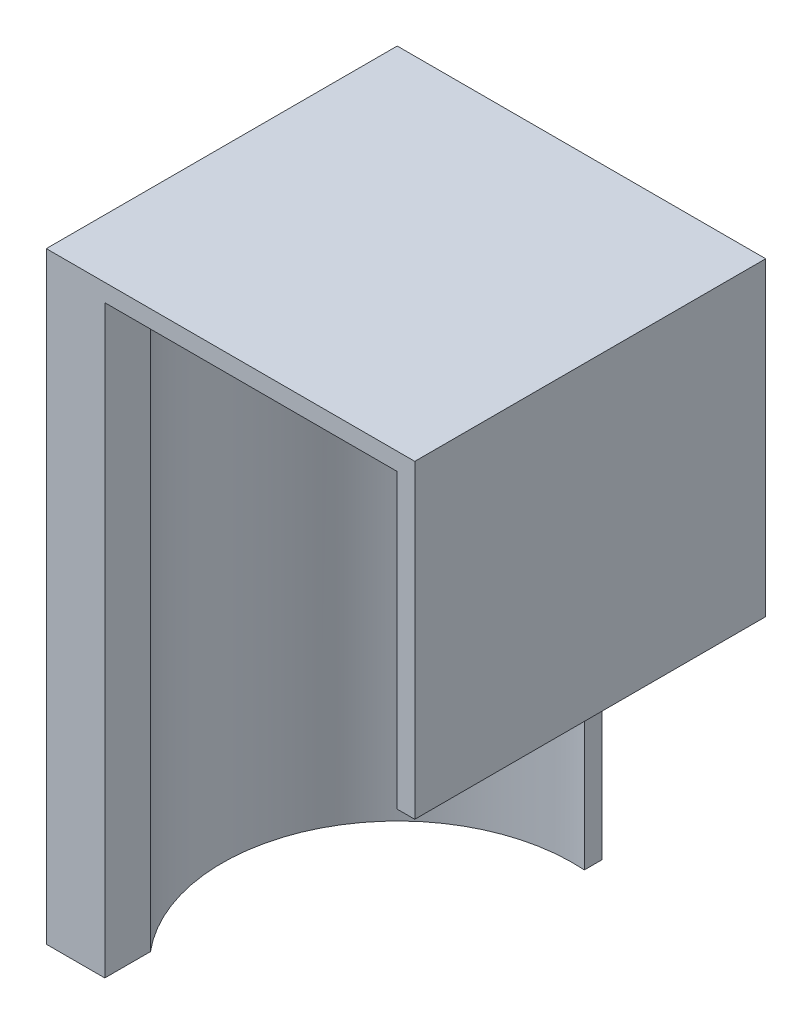
ISO-10303-21;
HEADER;
FILE_DESCRIPTION(('STEP AP214'),'2;1');
FILE_NAME('part.step','',(''),(''),'','','');
FILE_SCHEMA(('AUTOMOTIVE_DESIGN { 1 0 10303 214 1 1 1 1 }'));
ENDSEC;
DATA;
#1=APPLICATION_CONTEXT('core data for automotive mechanical design processes');
#2=APPLICATION_PROTOCOL_DEFINITION('international standard','automotive_design',2000,#1);
#3=PRODUCT_CONTEXT('',#1,'mechanical');
#4=PRODUCT('Part','Part','',(#3));
#5=PRODUCT_RELATED_PRODUCT_CATEGORY('part','',(#4));
#6=PRODUCT_DEFINITION_FORMATION('','',#4);
#7=PRODUCT_DEFINITION_CONTEXT('part definition',#1,'design');
#8=PRODUCT_DEFINITION('design','',#6,#7);
#9=PRODUCT_DEFINITION_SHAPE('','',#8);
#10=(LENGTH_UNIT() NAMED_UNIT(*) SI_UNIT(.MILLI.,.METRE.));
#11=(NAMED_UNIT(*) PLANE_ANGLE_UNIT() SI_UNIT($,.RADIAN.));
#12=(NAMED_UNIT(*) SI_UNIT($,.STERADIAN.) SOLID_ANGLE_UNIT());
#13=UNCERTAINTY_MEASURE_WITH_UNIT(LENGTH_MEASURE(1.E-05),#10,'distance_accuracy_value','');
#14=(GEOMETRIC_REPRESENTATION_CONTEXT(3) GLOBAL_UNCERTAINTY_ASSIGNED_CONTEXT((#13)) GLOBAL_UNIT_ASSIGNED_CONTEXT((#10,
#11,#12)) REPRESENTATION_CONTEXT('',''));
#15=CARTESIAN_POINT('',(0.,0.,0.));
#16=DIRECTION('',(0.,0.,1.));
#17=DIRECTION('',(1.,0.,0.));
#18=AXIS2_PLACEMENT_3D('',#15,#16,#17);
#19=CARTESIAN_POINT('',(63.,50.,-27.));
#20=DIRECTION('',(0.,0.,-1.));
#21=DIRECTION('',(0.,1.,0.));
#22=AXIS2_PLACEMENT_3D('',#19,#20,#21);
#23=PLANE('',#22);
#24=DIRECTION('',(-1.,0.,0.));
#25=VECTOR('',#24,1.);
#26=CARTESIAN_POINT('',(63.,50.,-27.));
#27=LINE('',#26,#25);
#28=CARTESIAN_POINT('',(60.,50.,-27.));
#29=VERTEX_POINT('',#28);
#30=CARTESIAN_POINT('',(30.9999999999999,50.,-27.));
#31=VERTEX_POINT('',#30);
#32=EDGE_CURVE('E54',#29,#31,#27,.T.);
#33=ORIENTED_EDGE('',*,*,#32,.T.);
#34=DIRECTION('',(0.,1.,0.));
#35=VECTOR('',#34,1.);
#36=CARTESIAN_POINT('',(31.0000000000002,-119.462219947249,-27.));
#37=LINE('',#36,#35);
#38=CARTESIAN_POINT('',(31.,0.,-27.));
#39=VERTEX_POINT('',#38);
#40=EDGE_CURVE('E127',#39,#31,#37,.T.);
#41=ORIENTED_EDGE('',*,*,#40,.F.);
#42=DIRECTION('',(-1.,0.,0.));
#43=VECTOR('',#42,1.);
#44=CARTESIAN_POINT('',(63.,0.,-27.));
#45=LINE('',#44,#43);
#46=CARTESIAN_POINT('',(35.,0.,-27.));
#47=VERTEX_POINT('',#46);
#48=EDGE_CURVE('E195',#47,#39,#45,.T.);
#49=ORIENTED_EDGE('',*,*,#48,.F.);
#50=CARTESIAN_POINT('',(60.,0.,-27.));
#51=VERTEX_POINT('',#50);
#52=EDGE_CURVE('E196',#51,#47,#45,.T.);
#53=ORIENTED_EDGE('',*,*,#52,.F.);
#54=DIRECTION('',(0.,-1.,0.));
#55=VECTOR('',#54,1.);
#56=CARTESIAN_POINT('',(60.,50.,-27.));
#57=LINE('',#56,#55);
#58=EDGE_CURVE('E170',#29,#51,#57,.T.);
#59=ORIENTED_EDGE('',*,*,#58,.F.);
#60=EDGE_LOOP('',(#33,#41,#49,#53,#59));
#61=FACE_BOUND('',#60,.T.);
#62=ADVANCED_FACE('F39',(#61),#23,.F.);
#63=CARTESIAN_POINT('',(63.,0.,-30.));
#64=DIRECTION('',(0.,1.,0.));
#65=DIRECTION('',(0.,0.,1.));
#66=AXIS2_PLACEMENT_3D('',#63,#64,#65);
#67=PLANE('',#66);
#68=CARTESIAN_POINT('',(33.,0.,2.93325909419152));
#69=DIRECTION('',(0.,1.,0.));
#70=DIRECTION('',(0.,0.,1.));
#71=AXIS2_PLACEMENT_3D('',#68,#69,#70);
#72=CIRCLE('',#71,30.);
#73=EDGE_CURVE('E155',#47,#39,#72,.T.);
#74=ORIENTED_EDGE('',*,*,#73,.F.);
#75=ORIENTED_EDGE('',*,*,#48,.T.);
#76=EDGE_LOOP('',(#74,#75));
#77=FACE_BOUND('',#76,.T.);
#78=ADVANCED_FACE('F240',(#77),#67,.F.);
#79=DIRECTION('',(0.,0.,1.));
#80=VECTOR('',#79,1.);
#81=CARTESIAN_POINT('',(35.,0.,-30.));
#82=LINE('',#81,#80);
#83=CARTESIAN_POINT('',(35.,0.,-30.));
#84=VERTEX_POINT('',#83);
#85=EDGE_CURVE('E11',#84,#47,#82,.T.);
#86=ORIENTED_EDGE('',*,*,#85,.F.);
#87=DIRECTION('',(-1.,0.,0.));
#88=VECTOR('',#87,1.);
#89=CARTESIAN_POINT('',(63.,0.,-30.));
#90=LINE('',#89,#88);
#91=CARTESIAN_POINT('',(63.,0.,-30.));
#92=VERTEX_POINT('',#91);
#93=EDGE_CURVE('E192',#92,#84,#90,.T.);
#94=ORIENTED_EDGE('',*,*,#93,.F.);
#95=DIRECTION('',(0.,0.,-1.));
#96=VECTOR('',#95,1.);
#97=CARTESIAN_POINT('',(63.,0.,-30.));
#98=LINE('',#97,#96);
#99=CARTESIAN_POINT('',(63.,0.,30.));
#100=VERTEX_POINT('',#99);
#101=EDGE_CURVE('E190',#100,#92,#98,.T.);
#102=ORIENTED_EDGE('',*,*,#101,.F.);
#103=DIRECTION('',(-1.,0.,0.));
#104=VECTOR('',#103,1.);
#105=CARTESIAN_POINT('',(63.,0.,30.));
#106=LINE('',#105,#104);
#107=CARTESIAN_POINT('',(60.,0.,30.));
#108=VERTEX_POINT('',#107);
#109=EDGE_CURVE('E176',#100,#108,#106,.T.);
#110=ORIENTED_EDGE('',*,*,#109,.T.);
#111=DIRECTION('',(0.,0.,-1.));
#112=VECTOR('',#111,1.);
#113=CARTESIAN_POINT('',(60.,0.,80.0899191454728));
#114=LINE('',#113,#112);
#115=EDGE_CURVE('E182',#108,#51,#114,.T.);
#116=ORIENTED_EDGE('',*,*,#115,.T.);
#117=ORIENTED_EDGE('',*,*,#52,.T.);
#118=EDGE_LOOP('',(#86,#94,#102,#110,#116,#117));
#119=FACE_BOUND('',#118,.T.);
#120=ADVANCED_FACE('F227',(#119),#67,.F.);
#121=CARTESIAN_POINT('',(0.,50.,0.));
#122=DIRECTION('',(0.,-1.,0.));
#123=DIRECTION('',(0.,0.,-1.));
#124=AXIS2_PLACEMENT_3D('',#121,#122,#123);
#125=PLANE('',#124);
#126=DIRECTION('',(1.,0.,0.));
#127=VECTOR('',#126,1.);
#128=CARTESIAN_POINT('',(63.,50.,30.));
#129=LINE('',#128,#127);
#130=CARTESIAN_POINT('',(10.,50.,30.));
#131=VERTEX_POINT('',#130);
#132=CARTESIAN_POINT('',(60.,50.,30.));
#133=VERTEX_POINT('',#132);
#134=EDGE_CURVE('E144',#131,#133,#129,.T.);
#135=ORIENTED_EDGE('',*,*,#134,.F.);
#136=DIRECTION('',(0.,0.,1.));
#137=VECTOR('',#136,1.);
#138=CARTESIAN_POINT('',(10.,50.,30.));
#139=LINE('',#138,#137);
#140=CARTESIAN_POINT('',(10.,50.,22.1946193784498));
#141=VERTEX_POINT('',#140);
#142=EDGE_CURVE('E135',#141,#131,#139,.T.);
#143=ORIENTED_EDGE('',*,*,#142,.F.);
#144=CARTESIAN_POINT('',(33.,50.,2.93325909419152));
#145=DIRECTION('',(0.,-1.,0.));
#146=DIRECTION('',(0.,0.,-1.));
#147=AXIS2_PLACEMENT_3D('',#144,#145,#146);
#148=CIRCLE('',#147,30.);
#149=EDGE_CURVE('E47',#141,#31,#148,.T.);
#150=ORIENTED_EDGE('',*,*,#149,.T.);
#151=ORIENTED_EDGE('',*,*,#32,.F.);
#152=DIRECTION('',(0.,0.,-1.));
#153=VECTOR('',#152,1.);
#154=CARTESIAN_POINT('',(60.,50.,80.0899191454728));
#155=LINE('',#154,#153);
#156=EDGE_CURVE('E184',#133,#29,#155,.T.);
#157=ORIENTED_EDGE('',*,*,#156,.F.);
#158=EDGE_LOOP('',(#135,#143,#150,#151,#157));
#159=FACE_BOUND('',#158,.T.);
#160=ADVANCED_FACE('F142',(#159),#125,.T.);
#161=CARTESIAN_POINT('',(3.,50.,30.));
#162=DIRECTION('',(0.,0.,-1.));
#163=DIRECTION('',(0.,1.,0.));
#164=AXIS2_PLACEMENT_3D('',#161,#162,#163);
#165=PLANE('',#164);
#166=DIRECTION('',(-1.,0.,0.));
#167=VECTOR('',#166,1.);
#168=CARTESIAN_POINT('',(3.,-50.,30.));
#169=LINE('',#168,#167);
#170=CARTESIAN_POINT('',(10.,-50.,30.));
#171=VERTEX_POINT('',#170);
#172=CARTESIAN_POINT('',(0.,-50.,30.));
#173=VERTEX_POINT('',#172);
#174=EDGE_CURVE('E130',#171,#173,#169,.T.);
#175=ORIENTED_EDGE('',*,*,#174,.F.);
#176=DIRECTION('',(0.,1.,0.));
#177=VECTOR('',#176,1.);
#178=CARTESIAN_POINT('',(10.,-119.462219947249,30.));
#179=LINE('',#178,#177);
#180=EDGE_CURVE('E140',#171,#131,#179,.T.);
#181=ORIENTED_EDGE('',*,*,#180,.T.);
#182=ORIENTED_EDGE('',*,*,#134,.T.);
#183=DIRECTION('',(0.,1.,0.));
#184=VECTOR('',#183,1.);
#185=CARTESIAN_POINT('',(60.,50.,30.));
#186=LINE('',#185,#184);
#187=EDGE_CURVE('E172',#108,#133,#186,.T.);
#188=ORIENTED_EDGE('',*,*,#187,.F.);
#189=ORIENTED_EDGE('',*,*,#109,.F.);
#190=DIRECTION('',(0.,-1.,0.));
#191=VECTOR('',#190,1.);
#192=CARTESIAN_POINT('',(63.,50.,30.));
#193=LINE('',#192,#191);
#194=CARTESIAN_POINT('',(63.,53.,30.));
#195=VERTEX_POINT('',#194);
#196=EDGE_CURVE('E175',#195,#100,#193,.T.);
#197=ORIENTED_EDGE('',*,*,#196,.F.);
#198=DIRECTION('',(1.,0.,0.));
#199=VECTOR('',#198,1.);
#200=CARTESIAN_POINT('',(63.,53.,30.));
#201=LINE('',#200,#199);
#202=CARTESIAN_POINT('',(0.,53.,30.));
#203=VERTEX_POINT('',#202);
#204=EDGE_CURVE('E167',#203,#195,#201,.T.);
#205=ORIENTED_EDGE('',*,*,#204,.F.);
#206=DIRECTION('',(0.,-1.,0.));
#207=VECTOR('',#206,1.);
#208=CARTESIAN_POINT('',(0.,50.,30.));
#209=LINE('',#208,#207);
#210=EDGE_CURVE('E200',#203,#173,#209,.T.);
#211=ORIENTED_EDGE('',*,*,#210,.T.);
#212=EDGE_LOOP('',(#175,#181,#182,#188,#189,#197,#205,#211));
#213=FACE_BOUND('',#212,.T.);
#214=ADVANCED_FACE('F41',(#213),#165,.F.);
#215=CARTESIAN_POINT('',(3.,-50.,-30.));
#216=DIRECTION('',(0.,1.,0.));
#217=DIRECTION('',(0.,0.,1.));
#218=AXIS2_PLACEMENT_3D('',#215,#216,#217);
#219=PLANE('',#218);
#220=DIRECTION('',(0.,0.,-1.));
#221=VECTOR('',#220,1.);
#222=CARTESIAN_POINT('',(0.,-50.,-30.));
#223=LINE('',#222,#221);
#224=CARTESIAN_POINT('',(0.,-50.,-30.));
#225=VERTEX_POINT('',#224);
#226=EDGE_CURVE('E62',#173,#225,#223,.T.);
#227=ORIENTED_EDGE('',*,*,#226,.T.);
#228=DIRECTION('',(-1.,0.,0.));
#229=VECTOR('',#228,1.);
#230=CARTESIAN_POINT('',(3.,-50.,-30.));
#231=LINE('',#230,#229);
#232=CARTESIAN_POINT('',(35.,-50.,-30.));
#233=VERTEX_POINT('',#232);
#234=EDGE_CURVE('E205',#233,#225,#231,.T.);
#235=ORIENTED_EDGE('',*,*,#234,.F.);
#236=DIRECTION('',(0.,0.,-1.));
#237=VECTOR('',#236,1.);
#238=CARTESIAN_POINT('',(35.,-50.,-30.));
#239=LINE('',#238,#237);
#240=CARTESIAN_POINT('',(35.,-50.,-27.));
#241=VERTEX_POINT('',#240);
#242=EDGE_CURVE('E149',#241,#233,#239,.T.);
#243=ORIENTED_EDGE('',*,*,#242,.F.);
#244=CARTESIAN_POINT('',(33.,-50.,2.93325909419152));
#245=DIRECTION('',(0.,1.,0.));
#246=DIRECTION('',(0.,0.,1.));
#247=AXIS2_PLACEMENT_3D('',#244,#245,#246);
#248=CIRCLE('',#247,30.);
#249=CARTESIAN_POINT('',(10.,-50.,22.1946193784498));
#250=VERTEX_POINT('',#249);
#251=EDGE_CURVE('E235',#250,#241,#248,.F.);
#252=ORIENTED_EDGE('',*,*,#251,.F.);
#253=DIRECTION('',(0.,0.,-1.));
#254=VECTOR('',#253,1.);
#255=CARTESIAN_POINT('',(10.,-50.,30.));
#256=LINE('',#255,#254);
#257=EDGE_CURVE('E138',#171,#250,#256,.T.);
#258=ORIENTED_EDGE('',*,*,#257,.F.);
#259=ORIENTED_EDGE('',*,*,#174,.T.);
#260=EDGE_LOOP('',(#227,#235,#243,#252,#258,#259));
#261=FACE_BOUND('',#260,.T.);
#262=ADVANCED_FACE('F207',(#261),#219,.F.);
#263=CARTESIAN_POINT('',(3.,50.,-30.));
#264=DIRECTION('',(0.,0.,1.));
#265=DIRECTION('',(0.,-1.,0.));
#266=AXIS2_PLACEMENT_3D('',#263,#264,#265);
#267=PLANE('',#266);
#268=DIRECTION('',(0.,1.,0.));
#269=VECTOR('',#268,1.);
#270=CARTESIAN_POINT('',(0.,50.,-30.));
#271=LINE('',#270,#269);
#272=CARTESIAN_POINT('',(0.,53.,-30.));
#273=VERTEX_POINT('',#272);
#274=EDGE_CURVE('E203',#225,#273,#271,.T.);
#275=ORIENTED_EDGE('',*,*,#274,.T.);
#276=DIRECTION('',(-1.,0.,0.));
#277=VECTOR('',#276,1.);
#278=CARTESIAN_POINT('',(63.,53.,-30.));
#279=LINE('',#278,#277);
#280=CARTESIAN_POINT('',(63.,53.,-30.));
#281=VERTEX_POINT('',#280);
#282=EDGE_CURVE('E161',#281,#273,#279,.T.);
#283=ORIENTED_EDGE('',*,*,#282,.F.);
#284=DIRECTION('',(0.,1.,0.));
#285=VECTOR('',#284,1.);
#286=CARTESIAN_POINT('',(63.,50.,-30.));
#287=LINE('',#286,#285);
#288=EDGE_CURVE('E179',#92,#281,#287,.T.);
#289=ORIENTED_EDGE('',*,*,#288,.F.);
#290=ORIENTED_EDGE('',*,*,#93,.T.);
#291=DIRECTION('',(0.,1.,0.));
#292=VECTOR('',#291,1.);
#293=CARTESIAN_POINT('',(35.,-119.462219947249,-30.));
#294=LINE('',#293,#292);
#295=EDGE_CURVE('E145',#233,#84,#294,.T.);
#296=ORIENTED_EDGE('',*,*,#295,.F.);
#297=ORIENTED_EDGE('',*,*,#234,.T.);
#298=EDGE_LOOP('',(#275,#283,#289,#290,#296,#297));
#299=FACE_BOUND('',#298,.T.);
#300=ADVANCED_FACE('F216',(#299),#267,.F.);
#301=CARTESIAN_POINT('',(0.,0.,0.));
#302=DIRECTION('',(-1.,0.,0.));
#303=DIRECTION('',(0.,0.,1.));
#304=AXIS2_PLACEMENT_3D('',#301,#302,#303);
#305=PLANE('',#304);
#306=DIRECTION('',(0.,0.,1.));
#307=VECTOR('',#306,1.);
#308=CARTESIAN_POINT('',(0.,53.,-30.));
#309=LINE('',#308,#307);
#310=EDGE_CURVE('E164',#273,#203,#309,.T.);
#311=ORIENTED_EDGE('',*,*,#310,.F.);
#312=ORIENTED_EDGE('',*,*,#274,.F.);
#313=ORIENTED_EDGE('',*,*,#226,.F.);
#314=ORIENTED_EDGE('',*,*,#210,.F.);
#315=EDGE_LOOP('',(#311,#312,#313,#314));
#316=FACE_BOUND('',#315,.T.);
#317=ADVANCED_FACE('F213',(#316),#305,.T.);
#318=CARTESIAN_POINT('',(63.,0.,0.));
#319=DIRECTION('',(-1.,0.,0.));
#320=DIRECTION('',(0.,0.,1.));
#321=AXIS2_PLACEMENT_3D('',#318,#319,#320);
#322=PLANE('',#321);
#323=ORIENTED_EDGE('',*,*,#288,.T.);
#324=DIRECTION('',(0.,0.,-1.));
#325=VECTOR('',#324,1.);
#326=CARTESIAN_POINT('',(63.,53.,-30.));
#327=LINE('',#326,#325);
#328=EDGE_CURVE('E158',#195,#281,#327,.T.);
#329=ORIENTED_EDGE('',*,*,#328,.F.);
#330=ORIENTED_EDGE('',*,*,#196,.T.);
#331=ORIENTED_EDGE('',*,*,#101,.T.);
#332=EDGE_LOOP('',(#323,#329,#330,#331));
#333=FACE_BOUND('',#332,.T.);
#334=ADVANCED_FACE('F223',(#333),#322,.F.);
#335=CARTESIAN_POINT('',(60.,50.,80.0899191454728));
#336=DIRECTION('',(1.,0.,0.));
#337=DIRECTION('',(0.,1.,0.));
#338=AXIS2_PLACEMENT_3D('',#335,#336,#337);
#339=PLANE('',#338);
#340=ORIENTED_EDGE('',*,*,#115,.F.);
#341=ORIENTED_EDGE('',*,*,#187,.T.);
#342=ORIENTED_EDGE('',*,*,#156,.T.);
#343=ORIENTED_EDGE('',*,*,#58,.T.);
#344=EDGE_LOOP('',(#340,#341,#342,#343));
#345=FACE_BOUND('',#344,.T.);
#346=ADVANCED_FACE('F243',(#345),#339,.F.);
#347=CARTESIAN_POINT('',(0.,53.,0.));
#348=DIRECTION('',(0.,-1.,0.));
#349=DIRECTION('',(0.,0.,-1.));
#350=AXIS2_PLACEMENT_3D('',#347,#348,#349);
#351=PLANE('',#350);
#352=ORIENTED_EDGE('',*,*,#328,.T.);
#353=ORIENTED_EDGE('',*,*,#282,.T.);
#354=ORIENTED_EDGE('',*,*,#310,.T.);
#355=ORIENTED_EDGE('',*,*,#204,.T.);
#356=EDGE_LOOP('',(#352,#353,#354,#355));
#357=FACE_BOUND('',#356,.T.);
#358=ADVANCED_FACE('F220',(#357),#351,.F.);
#359=CARTESIAN_POINT('',(35.,-119.462219947249,-30.));
#360=DIRECTION('',(-1.,0.,0.));
#361=DIRECTION('',(0.,0.,1.));
#362=AXIS2_PLACEMENT_3D('',#359,#360,#361);
#363=PLANE('',#362);
#364=ORIENTED_EDGE('',*,*,#295,.T.);
#365=ORIENTED_EDGE('',*,*,#85,.T.);
#366=DIRECTION('',(0.,1.,0.));
#367=VECTOR('',#366,1.);
#368=CARTESIAN_POINT('',(35.,-119.462219947249,-27.));
#369=LINE('',#368,#367);
#370=EDGE_CURVE('E139',#241,#47,#369,.T.);
#371=ORIENTED_EDGE('',*,*,#370,.F.);
#372=ORIENTED_EDGE('',*,*,#242,.T.);
#373=EDGE_LOOP('',(#364,#365,#371,#372));
#374=FACE_BOUND('',#373,.T.);
#375=ADVANCED_FACE('F232',(#374),#363,.F.);
#376=CARTESIAN_POINT('',(33.,-119.462219947249,2.93325909419152));
#377=DIRECTION('',(0.,1.,0.));
#378=DIRECTION('',(0.,0.,1.));
#379=AXIS2_PLACEMENT_3D('',#376,#377,#378);
#380=CYLINDRICAL_SURFACE('',#379,30.);
#381=ORIENTED_EDGE('',*,*,#251,.T.);
#382=ORIENTED_EDGE('',*,*,#370,.T.);
#383=ORIENTED_EDGE('',*,*,#73,.T.);
#384=ORIENTED_EDGE('',*,*,#40,.T.);
#385=ORIENTED_EDGE('',*,*,#149,.F.);
#386=DIRECTION('',(0.,1.,0.));
#387=VECTOR('',#386,1.);
#388=CARTESIAN_POINT('',(10.,-119.462219947249,22.1946193784498));
#389=LINE('',#388,#387);
#390=EDGE_CURVE('E125',#250,#141,#389,.T.);
#391=ORIENTED_EDGE('',*,*,#390,.F.);
#392=EDGE_LOOP('',(#381,#382,#383,#384,#385,#391));
#393=FACE_BOUND('',#392,.T.);
#394=ADVANCED_FACE('F124',(#393),#380,.F.);
#395=CARTESIAN_POINT('',(10.,-119.462219947249,30.));
#396=DIRECTION('',(-1.,0.,0.));
#397=DIRECTION('',(0.,0.,1.));
#398=AXIS2_PLACEMENT_3D('',#395,#396,#397);
#399=PLANE('',#398);
#400=ORIENTED_EDGE('',*,*,#180,.F.);
#401=ORIENTED_EDGE('',*,*,#257,.T.);
#402=ORIENTED_EDGE('',*,*,#390,.T.);
#403=ORIENTED_EDGE('',*,*,#142,.T.);
#404=EDGE_LOOP('',(#400,#401,#402,#403));
#405=FACE_BOUND('',#404,.T.);
#406=ADVANCED_FACE('F134',(#405),#399,.F.);
#407=CLOSED_SHELL('',(#62,#78,#120,#160,#214,#262,#300,#317,#334,#346,#358,#375,#394,#406));
#408=MANIFOLD_SOLID_BREP('B2',#407);
#409=ADVANCED_BREP_SHAPE_REPRESENTATION('',(#18,#408),#14);
#410=SHAPE_DEFINITION_REPRESENTATION(#9,#409);
ENDSEC;
END-ISO-10303-21;
